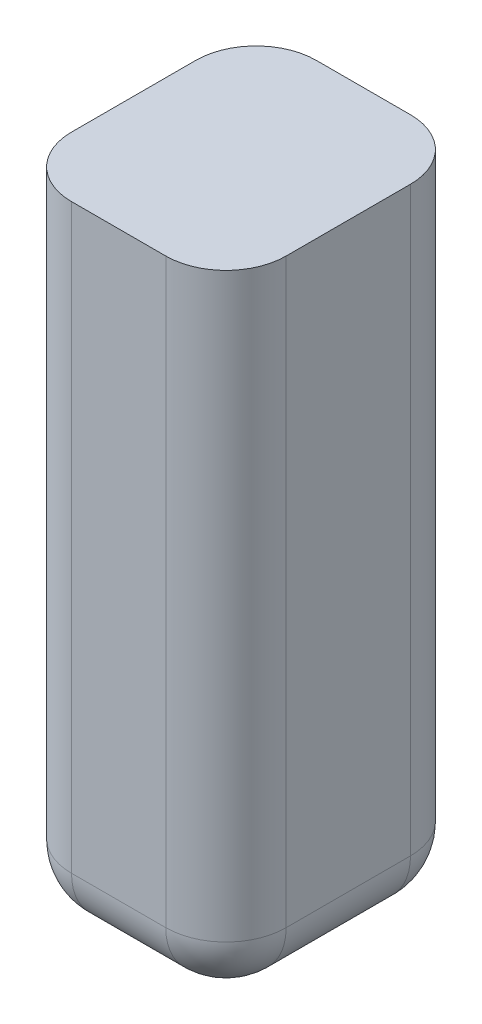
ISO-10303-21;
HEADER;
FILE_DESCRIPTION(('STEP AP214'),'2;1');
FILE_NAME('part.step','',(''),(''),'','','');
FILE_SCHEMA(('AUTOMOTIVE_DESIGN { 1 0 10303 214 1 1 1 1 }'));
ENDSEC;
DATA;
#1=APPLICATION_CONTEXT('core data for automotive mechanical design processes');
#2=APPLICATION_PROTOCOL_DEFINITION('international standard','automotive_design',2000,#1);
#3=PRODUCT_CONTEXT('',#1,'mechanical');
#4=PRODUCT('Part','Part','',(#3));
#5=PRODUCT_RELATED_PRODUCT_CATEGORY('part','',(#4));
#6=PRODUCT_DEFINITION_FORMATION('','',#4);
#7=PRODUCT_DEFINITION_CONTEXT('part definition',#1,'design');
#8=PRODUCT_DEFINITION('design','',#6,#7);
#9=PRODUCT_DEFINITION_SHAPE('','',#8);
#10=(LENGTH_UNIT() NAMED_UNIT(*) SI_UNIT(.MILLI.,.METRE.));
#11=(NAMED_UNIT(*) PLANE_ANGLE_UNIT() SI_UNIT($,.RADIAN.));
#12=(NAMED_UNIT(*) SI_UNIT($,.STERADIAN.) SOLID_ANGLE_UNIT());
#13=UNCERTAINTY_MEASURE_WITH_UNIT(LENGTH_MEASURE(1.E-05),#10,'distance_accuracy_value','');
#14=(GEOMETRIC_REPRESENTATION_CONTEXT(3) GLOBAL_UNCERTAINTY_ASSIGNED_CONTEXT((#13)) GLOBAL_UNIT_ASSIGNED_CONTEXT((#10,
#11,#12)) REPRESENTATION_CONTEXT('',''));
#15=CARTESIAN_POINT('',(0.,0.,0.));
#16=DIRECTION('',(0.,0.,1.));
#17=DIRECTION('',(1.,0.,0.));
#18=AXIS2_PLACEMENT_3D('',#15,#16,#17);
#19=CARTESIAN_POINT('',(0.,0.,0.));
#20=DIRECTION('',(0.,-1.,0.));
#21=DIRECTION('',(0.,0.,-1.));
#22=AXIS2_PLACEMENT_3D('',#19,#20,#21);
#23=PLANE('',#22);
#24=DIRECTION('',(1.,0.,0.));
#25=VECTOR('',#24,1.);
#26=CARTESIAN_POINT('',(-2.675,0.,1.55));
#27=LINE('',#26,#25);
#28=CARTESIAN_POINT('',(1.175,0.,1.55));
#29=VERTEX_POINT('',#28);
#30=CARTESIAN_POINT('',(-1.175,0.,1.55));
#31=VERTEX_POINT('',#30);
#32=EDGE_CURVE('E178',#29,#31,#27,.F.);
#33=ORIENTED_EDGE('',*,*,#32,.T.);
#34=DIRECTION('',(0.,0.,1.));
#35=VECTOR('',#34,1.);
#36=CARTESIAN_POINT('',(-1.175,0.,-3.05));
#37=LINE('',#36,#35);
#38=CARTESIAN_POINT('',(-1.175,0.,-1.55));
#39=VERTEX_POINT('',#38);
#40=EDGE_CURVE('E195',#31,#39,#37,.F.);
#41=ORIENTED_EDGE('',*,*,#40,.T.);
#42=DIRECTION('',(-1.,0.,0.));
#43=VECTOR('',#42,1.);
#44=CARTESIAN_POINT('',(2.675,0.,-1.55));
#45=LINE('',#44,#43);
#46=CARTESIAN_POINT('',(1.175,0.,-1.55));
#47=VERTEX_POINT('',#46);
#48=EDGE_CURVE('E191',#39,#47,#45,.F.);
#49=ORIENTED_EDGE('',*,*,#48,.T.);
#50=DIRECTION('',(0.,0.,-1.));
#51=VECTOR('',#50,1.);
#52=CARTESIAN_POINT('',(1.175,0.,3.05));
#53=LINE('',#52,#51);
#54=EDGE_CURVE('E187',#47,#29,#53,.F.);
#55=ORIENTED_EDGE('',*,*,#54,.T.);
#56=EDGE_LOOP('',(#33,#41,#49,#55));
#57=FACE_BOUND('',#56,.T.);
#58=DIRECTION('',(1.,0.,0.));
#59=VECTOR('',#58,1.);
#60=CARTESIAN_POINT('',(-0.675,0.,1.05));
#61=LINE('',#60,#59);
#62=CARTESIAN_POINT('',(-0.675,0.,1.05));
#63=VERTEX_POINT('',#62);
#64=CARTESIAN_POINT('',(0.675,0.,1.05));
#65=VERTEX_POINT('',#64);
#66=EDGE_CURVE('E166',#63,#65,#61,.T.);
#67=ORIENTED_EDGE('',*,*,#66,.T.);
#68=DIRECTION('',(0.,0.,-1.));
#69=VECTOR('',#68,1.);
#70=CARTESIAN_POINT('',(0.675,0.,1.05));
#71=LINE('',#70,#69);
#72=CARTESIAN_POINT('',(0.675,0.,-1.05));
#73=VERTEX_POINT('',#72);
#74=EDGE_CURVE('E556',#65,#73,#71,.T.);
#75=ORIENTED_EDGE('',*,*,#74,.T.);
#76=DIRECTION('',(-1.,0.,0.));
#77=VECTOR('',#76,1.);
#78=CARTESIAN_POINT('',(-0.675,0.,-1.05));
#79=LINE('',#78,#77);
#80=CARTESIAN_POINT('',(-0.675,0.,-1.05));
#81=VERTEX_POINT('',#80);
#82=EDGE_CURVE('E170',#73,#81,#79,.T.);
#83=ORIENTED_EDGE('',*,*,#82,.T.);
#84=DIRECTION('',(0.,0.,1.));
#85=VECTOR('',#84,1.);
#86=CARTESIAN_POINT('',(-0.675,0.,1.05));
#87=LINE('',#86,#85);
#88=EDGE_CURVE('E550',#81,#63,#87,.T.);
#89=ORIENTED_EDGE('',*,*,#88,.T.);
#90=EDGE_LOOP('',(#67,#75,#83,#89));
#91=FACE_BOUND('',#90,.T.);
#92=ADVANCED_FACE('F41',(#57,#91),#23,.T.);
#93=CARTESIAN_POINT('',(-2.675,6.,3.05));
#94=DIRECTION('',(1.,0.,0.));
#95=DIRECTION('',(0.,0.,-1.));
#96=AXIS2_PLACEMENT_3D('',#93,#94,#95);
#97=PLANE('',#96);
#98=DIRECTION('',(0.,0.,1.));
#99=VECTOR('',#98,1.);
#100=CARTESIAN_POINT('',(-2.675,16.,-3.05));
#101=LINE('',#100,#99);
#102=CARTESIAN_POINT('',(-2.675,16.,-1.55));
#103=VERTEX_POINT('',#102);
#104=CARTESIAN_POINT('',(-2.675,16.,1.55));
#105=VERTEX_POINT('',#104);
#106=EDGE_CURVE('E314',#103,#105,#101,.T.);
#107=ORIENTED_EDGE('',*,*,#106,.F.);
#108=DIRECTION('',(0.,-1.,0.));
#109=VECTOR('',#108,1.);
#110=CARTESIAN_POINT('',(-2.675,6.,-1.55));
#111=LINE('',#110,#109);
#112=CARTESIAN_POINT('',(-2.675,1.5,-1.55));
#113=VERTEX_POINT('',#112);
#114=EDGE_CURVE('E241',#103,#113,#111,.T.);
#115=ORIENTED_EDGE('',*,*,#114,.T.);
#116=DIRECTION('',(0.,0.,1.));
#117=VECTOR('',#116,1.);
#118=CARTESIAN_POINT('',(-2.675,1.5,3.05));
#119=LINE('',#118,#117);
#120=CARTESIAN_POINT('',(-2.675,1.5,1.55));
#121=VERTEX_POINT('',#120);
#122=EDGE_CURVE('E172',#113,#121,#119,.T.);
#123=ORIENTED_EDGE('',*,*,#122,.T.);
#124=DIRECTION('',(0.,-1.,0.));
#125=VECTOR('',#124,1.);
#126=CARTESIAN_POINT('',(-2.675,6.,1.55));
#127=LINE('',#126,#125);
#128=EDGE_CURVE('E238',#121,#105,#127,.F.);
#129=ORIENTED_EDGE('',*,*,#128,.T.);
#130=EDGE_LOOP('',(#107,#115,#123,#129));
#131=FACE_BOUND('',#130,.T.);
#132=ADVANCED_FACE('F312',(#131),#97,.F.);
#133=CARTESIAN_POINT('',(-2.675,6.,3.05));
#134=DIRECTION('',(0.,0.,-1.));
#135=DIRECTION('',(-1.,0.,0.));
#136=AXIS2_PLACEMENT_3D('',#133,#134,#135);
#137=PLANE('',#136);
#138=DIRECTION('',(1.,0.,0.));
#139=VECTOR('',#138,1.);
#140=CARTESIAN_POINT('',(-2.675,16.,3.05));
#141=LINE('',#140,#139);
#142=CARTESIAN_POINT('',(-1.175,16.,3.05));
#143=VERTEX_POINT('',#142);
#144=CARTESIAN_POINT('',(1.175,16.,3.05));
#145=VERTEX_POINT('',#144);
#146=EDGE_CURVE('E300',#143,#145,#141,.T.);
#147=ORIENTED_EDGE('',*,*,#146,.F.);
#148=DIRECTION('',(0.,-1.,0.));
#149=VECTOR('',#148,1.);
#150=CARTESIAN_POINT('',(-1.175,6.,3.05));
#151=LINE('',#150,#149);
#152=CARTESIAN_POINT('',(-1.175,1.5,3.05));
#153=VERTEX_POINT('',#152);
#154=EDGE_CURVE('E11',#143,#153,#151,.T.);
#155=ORIENTED_EDGE('',*,*,#154,.T.);
#156=DIRECTION('',(1.,0.,0.));
#157=VECTOR('',#156,1.);
#158=CARTESIAN_POINT('',(2.675,1.5,3.05));
#159=LINE('',#158,#157);
#160=CARTESIAN_POINT('',(1.175,1.5,3.05));
#161=VERTEX_POINT('',#160);
#162=EDGE_CURVE('E206',#153,#161,#159,.T.);
#163=ORIENTED_EDGE('',*,*,#162,.T.);
#164=DIRECTION('',(0.,-1.,0.));
#165=VECTOR('',#164,1.);
#166=CARTESIAN_POINT('',(1.175,6.,3.05));
#167=LINE('',#166,#165);
#168=EDGE_CURVE('E51',#161,#145,#167,.F.);
#169=ORIENTED_EDGE('',*,*,#168,.T.);
#170=EDGE_LOOP('',(#147,#155,#163,#169));
#171=FACE_BOUND('',#170,.T.);
#172=ADVANCED_FACE('F298',(#171),#137,.F.);
#173=CARTESIAN_POINT('',(2.675,6.,3.05));
#174=DIRECTION('',(-1.,0.,0.));
#175=DIRECTION('',(0.,0.,1.));
#176=AXIS2_PLACEMENT_3D('',#173,#174,#175);
#177=PLANE('',#176);
#178=DIRECTION('',(0.,0.,-1.));
#179=VECTOR('',#178,1.);
#180=CARTESIAN_POINT('',(2.675,1.5,-3.05));
#181=LINE('',#180,#179);
#182=CARTESIAN_POINT('',(2.675,1.5,1.55));
#183=VERTEX_POINT('',#182);
#184=CARTESIAN_POINT('',(2.675,1.5,-1.55));
#185=VERTEX_POINT('',#184);
#186=EDGE_CURVE('E203',#183,#185,#181,.T.);
#187=ORIENTED_EDGE('',*,*,#186,.T.);
#188=DIRECTION('',(0.,-1.,0.));
#189=VECTOR('',#188,1.);
#190=CARTESIAN_POINT('',(2.675,6.,-1.55));
#191=LINE('',#190,#189);
#192=CARTESIAN_POINT('',(2.675,16.,-1.55));
#193=VERTEX_POINT('',#192);
#194=EDGE_CURVE('E59',#185,#193,#191,.F.);
#195=ORIENTED_EDGE('',*,*,#194,.T.);
#196=DIRECTION('',(0.,0.,-1.));
#197=VECTOR('',#196,1.);
#198=CARTESIAN_POINT('',(2.675,16.,3.05));
#199=LINE('',#198,#197);
#200=CARTESIAN_POINT('',(2.675,16.,1.55));
#201=VERTEX_POINT('',#200);
#202=EDGE_CURVE('E560',#201,#193,#199,.T.);
#203=ORIENTED_EDGE('',*,*,#202,.F.);
#204=DIRECTION('',(0.,-1.,0.));
#205=VECTOR('',#204,1.);
#206=CARTESIAN_POINT('',(2.675,6.,1.55));
#207=LINE('',#206,#205);
#208=EDGE_CURVE('E261',#201,#183,#207,.T.);
#209=ORIENTED_EDGE('',*,*,#208,.T.);
#210=EDGE_LOOP('',(#187,#195,#203,#209));
#211=FACE_BOUND('',#210,.T.);
#212=ADVANCED_FACE('F333',(#211),#177,.F.);
#213=CARTESIAN_POINT('',(-2.675,6.,-3.05));
#214=DIRECTION('',(0.,0.,1.));
#215=DIRECTION('',(1.,0.,0.));
#216=AXIS2_PLACEMENT_3D('',#213,#214,#215);
#217=PLANE('',#216);
#218=DIRECTION('',(-1.,0.,0.));
#219=VECTOR('',#218,1.);
#220=CARTESIAN_POINT('',(-2.675,1.5,-3.05));
#221=LINE('',#220,#219);
#222=CARTESIAN_POINT('',(1.175,1.5,-3.05));
#223=VERTEX_POINT('',#222);
#224=CARTESIAN_POINT('',(-1.175,1.5,-3.05));
#225=VERTEX_POINT('',#224);
#226=EDGE_CURVE('E199',#223,#225,#221,.T.);
#227=ORIENTED_EDGE('',*,*,#226,.T.);
#228=DIRECTION('',(0.,-1.,0.));
#229=VECTOR('',#228,1.);
#230=CARTESIAN_POINT('',(-1.175,6.,-3.05));
#231=LINE('',#230,#229);
#232=CARTESIAN_POINT('',(-1.175,16.,-3.05));
#233=VERTEX_POINT('',#232);
#234=EDGE_CURVE('E247',#225,#233,#231,.F.);
#235=ORIENTED_EDGE('',*,*,#234,.T.);
#236=DIRECTION('',(-1.,0.,0.));
#237=VECTOR('',#236,1.);
#238=CARTESIAN_POINT('',(2.675,16.,-3.05));
#239=LINE('',#238,#237);
#240=CARTESIAN_POINT('',(1.175,16.,-3.05));
#241=VERTEX_POINT('',#240);
#242=EDGE_CURVE('E272',#241,#233,#239,.T.);
#243=ORIENTED_EDGE('',*,*,#242,.F.);
#244=DIRECTION('',(0.,-1.,0.));
#245=VECTOR('',#244,1.);
#246=CARTESIAN_POINT('',(1.175,6.,-3.05));
#247=LINE('',#246,#245);
#248=EDGE_CURVE('E244',#241,#223,#247,.T.);
#249=ORIENTED_EDGE('',*,*,#248,.T.);
#250=EDGE_LOOP('',(#227,#235,#243,#249));
#251=FACE_BOUND('',#250,.T.);
#252=ADVANCED_FACE('F360',(#251),#217,.F.);
#253=CARTESIAN_POINT('',(0.675,6.,1.05));
#254=DIRECTION('',(-1.,0.,0.));
#255=DIRECTION('',(0.,0.,1.));
#256=AXIS2_PLACEMENT_3D('',#253,#254,#255);
#257=PLANE('',#256);
#258=ORIENTED_EDGE('',*,*,#74,.F.);
#259=DIRECTION('',(0.,-1.,0.));
#260=VECTOR('',#259,1.);
#261=CARTESIAN_POINT('',(0.675,6.,1.05));
#262=LINE('',#261,#260);
#263=CARTESIAN_POINT('',(0.675,6.,1.05));
#264=VERTEX_POINT('',#263);
#265=EDGE_CURVE('E164',#264,#65,#262,.T.);
#266=ORIENTED_EDGE('',*,*,#265,.F.);
#267=DIRECTION('',(0.,0.,-1.));
#268=VECTOR('',#267,1.);
#269=CARTESIAN_POINT('',(0.675,6.,1.05));
#270=LINE('',#269,#268);
#271=CARTESIAN_POINT('',(0.675,6.,-1.05));
#272=VERTEX_POINT('',#271);
#273=EDGE_CURVE('E148',#264,#272,#270,.T.);
#274=ORIENTED_EDGE('',*,*,#273,.T.);
#275=DIRECTION('',(0.,-1.,0.));
#276=VECTOR('',#275,1.);
#277=CARTESIAN_POINT('',(0.675,6.,-1.05));
#278=LINE('',#277,#276);
#279=EDGE_CURVE('E161',#272,#73,#278,.T.);
#280=ORIENTED_EDGE('',*,*,#279,.T.);
#281=EDGE_LOOP('',(#258,#266,#274,#280));
#282=FACE_BOUND('',#281,.T.);
#283=ADVANCED_FACE('F160',(#282),#257,.T.);
#284=CARTESIAN_POINT('',(-0.675,6.,-1.05));
#285=DIRECTION('',(0.,0.,1.));
#286=DIRECTION('',(1.,0.,0.));
#287=AXIS2_PLACEMENT_3D('',#284,#285,#286);
#288=PLANE('',#287);
#289=ORIENTED_EDGE('',*,*,#82,.F.);
#290=ORIENTED_EDGE('',*,*,#279,.F.);
#291=DIRECTION('',(-1.,0.,0.));
#292=VECTOR('',#291,1.);
#293=CARTESIAN_POINT('',(-0.675,6.,-1.05));
#294=LINE('',#293,#292);
#295=CARTESIAN_POINT('',(-0.675,6.,-1.05));
#296=VERTEX_POINT('',#295);
#297=EDGE_CURVE('E145',#272,#296,#294,.T.);
#298=ORIENTED_EDGE('',*,*,#297,.T.);
#299=DIRECTION('',(0.,-1.,0.));
#300=VECTOR('',#299,1.);
#301=CARTESIAN_POINT('',(-0.675,6.,-1.05));
#302=LINE('',#301,#300);
#303=EDGE_CURVE('E173',#296,#81,#302,.T.);
#304=ORIENTED_EDGE('',*,*,#303,.T.);
#305=EDGE_LOOP('',(#289,#290,#298,#304));
#306=FACE_BOUND('',#305,.T.);
#307=ADVANCED_FACE('F168',(#306),#288,.T.);
#308=CARTESIAN_POINT('',(-0.675,6.,1.05));
#309=DIRECTION('',(1.,0.,0.));
#310=DIRECTION('',(0.,0.,-1.));
#311=AXIS2_PLACEMENT_3D('',#308,#309,#310);
#312=PLANE('',#311);
#313=ORIENTED_EDGE('',*,*,#88,.F.);
#314=ORIENTED_EDGE('',*,*,#303,.F.);
#315=DIRECTION('',(0.,0.,1.));
#316=VECTOR('',#315,1.);
#317=CARTESIAN_POINT('',(-0.675,6.,1.05));
#318=LINE('',#317,#316);
#319=CARTESIAN_POINT('',(-0.675,6.,1.05));
#320=VERTEX_POINT('',#319);
#321=EDGE_CURVE('E151',#296,#320,#318,.T.);
#322=ORIENTED_EDGE('',*,*,#321,.T.);
#323=DIRECTION('',(0.,-1.,0.));
#324=VECTOR('',#323,1.);
#325=CARTESIAN_POINT('',(-0.675,6.,1.05));
#326=LINE('',#325,#324);
#327=EDGE_CURVE('E180',#320,#63,#326,.T.);
#328=ORIENTED_EDGE('',*,*,#327,.T.);
#329=EDGE_LOOP('',(#313,#314,#322,#328));
#330=FACE_BOUND('',#329,.T.);
#331=ADVANCED_FACE('F513',(#330),#312,.T.);
#332=CARTESIAN_POINT('',(-0.675,6.,1.05));
#333=DIRECTION('',(0.,0.,-1.));
#334=DIRECTION('',(-1.,0.,0.));
#335=AXIS2_PLACEMENT_3D('',#332,#333,#334);
#336=PLANE('',#335);
#337=ORIENTED_EDGE('',*,*,#66,.F.);
#338=ORIENTED_EDGE('',*,*,#327,.F.);
#339=DIRECTION('',(1.,0.,0.));
#340=VECTOR('',#339,1.);
#341=CARTESIAN_POINT('',(-0.675,6.,1.05));
#342=LINE('',#341,#340);
#343=EDGE_CURVE('E567',#320,#264,#342,.T.);
#344=ORIENTED_EDGE('',*,*,#343,.T.);
#345=ORIENTED_EDGE('',*,*,#265,.T.);
#346=EDGE_LOOP('',(#337,#338,#344,#345));
#347=FACE_BOUND('',#346,.T.);
#348=ADVANCED_FACE('F472',(#347),#336,.T.);
#349=CARTESIAN_POINT('',(0.,6.,0.));
#350=DIRECTION('',(0.,1.,0.));
#351=DIRECTION('',(0.,0.,1.));
#352=AXIS2_PLACEMENT_3D('',#349,#350,#351);
#353=PLANE('',#352);
#354=ORIENTED_EDGE('',*,*,#273,.F.);
#355=ORIENTED_EDGE('',*,*,#343,.F.);
#356=ORIENTED_EDGE('',*,*,#321,.F.);
#357=ORIENTED_EDGE('',*,*,#297,.F.);
#358=EDGE_LOOP('',(#354,#355,#356,#357));
#359=FACE_BOUND('',#358,.T.);
#360=ADVANCED_FACE('F147',(#359),#353,.F.);
#361=CARTESIAN_POINT('',(0.,16.,0.));
#362=DIRECTION('',(0.,1.,0.));
#363=DIRECTION('',(0.,0.,1.));
#364=AXIS2_PLACEMENT_3D('',#361,#362,#363);
#365=PLANE('',#364);
#366=ORIENTED_EDGE('',*,*,#242,.T.);
#367=CARTESIAN_POINT('',(-1.175,16.,-1.55));
#368=DIRECTION('',(0.,1.,0.));
#369=DIRECTION('',(0.,0.,1.));
#370=AXIS2_PLACEMENT_3D('',#367,#368,#369);
#371=CIRCLE('',#370,1.5);
#372=EDGE_CURVE('E258',#233,#103,#371,.T.);
#373=ORIENTED_EDGE('',*,*,#372,.T.);
#374=ORIENTED_EDGE('',*,*,#106,.T.);
#375=CARTESIAN_POINT('',(-1.175,16.,1.55));
#376=DIRECTION('',(0.,1.,0.));
#377=DIRECTION('',(0.,0.,1.));
#378=AXIS2_PLACEMENT_3D('',#375,#376,#377);
#379=CIRCLE('',#378,1.5);
#380=EDGE_CURVE('E252',#105,#143,#379,.T.);
#381=ORIENTED_EDGE('',*,*,#380,.T.);
#382=ORIENTED_EDGE('',*,*,#146,.T.);
#383=CARTESIAN_POINT('',(1.175,16.,1.55));
#384=DIRECTION('',(0.,1.,0.));
#385=DIRECTION('',(0.,0.,1.));
#386=AXIS2_PLACEMENT_3D('',#383,#384,#385);
#387=CIRCLE('',#386,1.5);
#388=EDGE_CURVE('E66',#145,#201,#387,.T.);
#389=ORIENTED_EDGE('',*,*,#388,.T.);
#390=ORIENTED_EDGE('',*,*,#202,.T.);
#391=CARTESIAN_POINT('',(1.175,16.,-1.55));
#392=DIRECTION('',(0.,1.,0.));
#393=DIRECTION('',(0.,0.,1.));
#394=AXIS2_PLACEMENT_3D('',#391,#392,#393);
#395=CIRCLE('',#394,1.5);
#396=EDGE_CURVE('E255',#193,#241,#395,.T.);
#397=ORIENTED_EDGE('',*,*,#396,.T.);
#398=EDGE_LOOP('',(#366,#373,#374,#381,#382,#389,#390,#397));
#399=FACE_BOUND('',#398,.T.);
#400=ADVANCED_FACE('F376',(#399),#365,.T.);
#401=CARTESIAN_POINT('',(1.175,1.5,3.05));
#402=DIRECTION('',(0.,0.,1.));
#403=DIRECTION('',(1.,0.,0.));
#404=AXIS2_PLACEMENT_3D('',#401,#402,#403);
#405=CYLINDRICAL_SURFACE('',#404,1.5);
#406=ORIENTED_EDGE('',*,*,#54,.F.);
#407=CARTESIAN_POINT('',(1.175,1.5,-1.55));
#408=DIRECTION('',(0.,0.,1.));
#409=DIRECTION('',(1.,0.,0.));
#410=AXIS2_PLACEMENT_3D('',#407,#408,#409);
#411=CIRCLE('',#410,1.5);
#412=EDGE_CURVE('E228',#47,#185,#411,.T.);
#413=ORIENTED_EDGE('',*,*,#412,.T.);
#414=ORIENTED_EDGE('',*,*,#186,.F.);
#415=CARTESIAN_POINT('',(1.175,1.5,1.55));
#416=DIRECTION('',(0.,0.,1.));
#417=DIRECTION('',(1.,0.,0.));
#418=AXIS2_PLACEMENT_3D('',#415,#416,#417);
#419=CIRCLE('',#418,1.5);
#420=EDGE_CURVE('E225',#183,#29,#419,.F.);
#421=ORIENTED_EDGE('',*,*,#420,.T.);
#422=EDGE_LOOP('',(#406,#413,#414,#421));
#423=FACE_BOUND('',#422,.T.);
#424=ADVANCED_FACE('F331',(#423),#405,.T.);
#425=CARTESIAN_POINT('',(-2.675,1.5,-1.55));
#426=DIRECTION('',(1.,0.,0.));
#427=DIRECTION('',(0.,0.,-1.));
#428=AXIS2_PLACEMENT_3D('',#425,#426,#427);
#429=CYLINDRICAL_SURFACE('',#428,1.5);
#430=ORIENTED_EDGE('',*,*,#48,.F.);
#431=CARTESIAN_POINT('',(-1.175,1.5,-1.55));
#432=DIRECTION('',(1.,0.,0.));
#433=DIRECTION('',(0.,0.,-1.));
#434=AXIS2_PLACEMENT_3D('',#431,#432,#433);
#435=CIRCLE('',#434,1.5);
#436=EDGE_CURVE('E222',#39,#225,#435,.T.);
#437=ORIENTED_EDGE('',*,*,#436,.T.);
#438=ORIENTED_EDGE('',*,*,#226,.F.);
#439=CARTESIAN_POINT('',(1.175,1.5,-1.55));
#440=DIRECTION('',(1.,0.,0.));
#441=DIRECTION('',(0.,0.,-1.));
#442=AXIS2_PLACEMENT_3D('',#439,#440,#441);
#443=CIRCLE('',#442,1.5);
#444=EDGE_CURVE('E218',#223,#47,#443,.F.);
#445=ORIENTED_EDGE('',*,*,#444,.T.);
#446=EDGE_LOOP('',(#430,#437,#438,#445));
#447=FACE_BOUND('',#446,.T.);
#448=ADVANCED_FACE('F324',(#447),#429,.T.);
#449=CARTESIAN_POINT('',(-2.675,1.5,1.55));
#450=DIRECTION('',(-1.,0.,0.));
#451=DIRECTION('',(0.,0.,1.));
#452=AXIS2_PLACEMENT_3D('',#449,#450,#451);
#453=CYLINDRICAL_SURFACE('',#452,1.5);
#454=ORIENTED_EDGE('',*,*,#162,.F.);
#455=CARTESIAN_POINT('',(-1.175,1.5,1.55));
#456=DIRECTION('',(-1.,0.,0.));
#457=DIRECTION('',(0.,0.,1.));
#458=AXIS2_PLACEMENT_3D('',#455,#456,#457);
#459=CIRCLE('',#458,1.5);
#460=EDGE_CURVE('E235',#153,#31,#459,.F.);
#461=ORIENTED_EDGE('',*,*,#460,.T.);
#462=ORIENTED_EDGE('',*,*,#32,.F.);
#463=CARTESIAN_POINT('',(1.175,1.5,1.55));
#464=DIRECTION('',(-1.,0.,0.));
#465=DIRECTION('',(0.,0.,1.));
#466=AXIS2_PLACEMENT_3D('',#463,#464,#465);
#467=CIRCLE('',#466,1.5);
#468=EDGE_CURVE('E231',#29,#161,#467,.T.);
#469=ORIENTED_EDGE('',*,*,#468,.T.);
#470=EDGE_LOOP('',(#454,#461,#462,#469));
#471=FACE_BOUND('',#470,.T.);
#472=ADVANCED_FACE('F297',(#471),#453,.T.);
#473=CARTESIAN_POINT('',(-1.175,1.5,3.05));
#474=DIRECTION('',(0.,0.,-1.));
#475=DIRECTION('',(-1.,0.,0.));
#476=AXIS2_PLACEMENT_3D('',#473,#474,#475);
#477=CYLINDRICAL_SURFACE('',#476,1.5);
#478=ORIENTED_EDGE('',*,*,#122,.F.);
#479=CARTESIAN_POINT('',(-1.175,1.5,-1.55));
#480=DIRECTION('',(0.,0.,-1.));
#481=DIRECTION('',(-1.,0.,0.));
#482=AXIS2_PLACEMENT_3D('',#479,#480,#481);
#483=CIRCLE('',#482,1.5);
#484=EDGE_CURVE('E214',#113,#39,#483,.F.);
#485=ORIENTED_EDGE('',*,*,#484,.T.);
#486=ORIENTED_EDGE('',*,*,#40,.F.);
#487=CARTESIAN_POINT('',(-1.175,1.5,1.55));
#488=DIRECTION('',(0.,0.,-1.));
#489=DIRECTION('',(-1.,0.,0.));
#490=AXIS2_PLACEMENT_3D('',#487,#488,#489);
#491=CIRCLE('',#490,1.5);
#492=EDGE_CURVE('E210',#31,#121,#491,.T.);
#493=ORIENTED_EDGE('',*,*,#492,.T.);
#494=EDGE_LOOP('',(#478,#485,#486,#493));
#495=FACE_BOUND('',#494,.T.);
#496=ADVANCED_FACE('F310',(#495),#477,.T.);
#497=CARTESIAN_POINT('',(-1.175,6.,-1.55));
#498=DIRECTION('',(0.,-1.,0.));
#499=DIRECTION('',(0.,0.,-1.));
#500=AXIS2_PLACEMENT_3D('',#497,#498,#499);
#501=CYLINDRICAL_SURFACE('',#500,1.5);
#502=ORIENTED_EDGE('',*,*,#372,.F.);
#503=ORIENTED_EDGE('',*,*,#234,.F.);
#504=CARTESIAN_POINT('',(-1.175,1.5,-1.55));
#505=DIRECTION('',(0.,-1.,0.));
#506=DIRECTION('',(0.,0.,-1.));
#507=AXIS2_PLACEMENT_3D('',#504,#505,#506);
#508=CIRCLE('',#507,1.5);
#509=EDGE_CURVE('E268',#113,#225,#508,.T.);
#510=ORIENTED_EDGE('',*,*,#509,.F.);
#511=ORIENTED_EDGE('',*,*,#114,.F.);
#512=EDGE_LOOP('',(#502,#503,#510,#511));
#513=FACE_BOUND('',#512,.T.);
#514=ADVANCED_FACE('F317',(#513),#501,.T.);
#515=CARTESIAN_POINT('',(-1.175,1.5,-1.55));
#516=DIRECTION('',(0.,0.,1.));
#517=DIRECTION('',(1.,0.,0.));
#518=AXIS2_PLACEMENT_3D('',#515,#516,#517);
#519=SPHERICAL_SURFACE('',#518,1.5);
#520=ORIENTED_EDGE('',*,*,#509,.T.);
#521=ORIENTED_EDGE('',*,*,#436,.F.);
#522=ORIENTED_EDGE('',*,*,#484,.F.);
#523=EDGE_LOOP('',(#520,#521,#522));
#524=FACE_BOUND('',#523,.T.);
#525=ADVANCED_FACE('F321',(#524),#519,.T.);
#526=CARTESIAN_POINT('',(1.175,6.,-1.55));
#527=DIRECTION('',(0.,-1.,0.));
#528=DIRECTION('',(0.,0.,-1.));
#529=AXIS2_PLACEMENT_3D('',#526,#527,#528);
#530=CYLINDRICAL_SURFACE('',#529,1.5);
#531=ORIENTED_EDGE('',*,*,#396,.F.);
#532=ORIENTED_EDGE('',*,*,#194,.F.);
#533=CARTESIAN_POINT('',(1.175,1.5,-1.55));
#534=DIRECTION('',(0.,-1.,0.));
#535=DIRECTION('',(0.,0.,-1.));
#536=AXIS2_PLACEMENT_3D('',#533,#534,#535);
#537=CIRCLE('',#536,1.5);
#538=EDGE_CURVE('E273',#223,#185,#537,.T.);
#539=ORIENTED_EDGE('',*,*,#538,.F.);
#540=ORIENTED_EDGE('',*,*,#248,.F.);
#541=EDGE_LOOP('',(#531,#532,#539,#540));
#542=FACE_BOUND('',#541,.T.);
#543=ADVANCED_FACE('F337',(#542),#530,.T.);
#544=CARTESIAN_POINT('',(1.175,1.5,-1.55));
#545=DIRECTION('',(0.,0.,1.));
#546=DIRECTION('',(1.,0.,0.));
#547=AXIS2_PLACEMENT_3D('',#544,#545,#546);
#548=SPHERICAL_SURFACE('',#547,1.5);
#549=ORIENTED_EDGE('',*,*,#538,.T.);
#550=ORIENTED_EDGE('',*,*,#412,.F.);
#551=ORIENTED_EDGE('',*,*,#444,.F.);
#552=EDGE_LOOP('',(#549,#550,#551));
#553=FACE_BOUND('',#552,.T.);
#554=ADVANCED_FACE('F340',(#553),#548,.T.);
#555=CARTESIAN_POINT('',(-1.175,6.,1.55));
#556=DIRECTION('',(0.,-1.,0.));
#557=DIRECTION('',(0.,0.,-1.));
#558=AXIS2_PLACEMENT_3D('',#555,#556,#557);
#559=CYLINDRICAL_SURFACE('',#558,1.5);
#560=ORIENTED_EDGE('',*,*,#380,.F.);
#561=ORIENTED_EDGE('',*,*,#128,.F.);
#562=CARTESIAN_POINT('',(-1.175,1.5,1.55));
#563=DIRECTION('',(0.,-1.,0.));
#564=DIRECTION('',(0.,0.,-1.));
#565=AXIS2_PLACEMENT_3D('',#562,#563,#564);
#566=CIRCLE('',#565,1.5);
#567=EDGE_CURVE('E276',#153,#121,#566,.T.);
#568=ORIENTED_EDGE('',*,*,#567,.F.);
#569=ORIENTED_EDGE('',*,*,#154,.F.);
#570=EDGE_LOOP('',(#560,#561,#568,#569));
#571=FACE_BOUND('',#570,.T.);
#572=ADVANCED_FACE('F303',(#571),#559,.T.);
#573=CARTESIAN_POINT('',(-1.175,1.5,1.55));
#574=DIRECTION('',(0.,0.,1.));
#575=DIRECTION('',(1.,0.,0.));
#576=AXIS2_PLACEMENT_3D('',#573,#574,#575);
#577=SPHERICAL_SURFACE('',#576,1.5);
#578=ORIENTED_EDGE('',*,*,#492,.F.);
#579=ORIENTED_EDGE('',*,*,#460,.F.);
#580=ORIENTED_EDGE('',*,*,#567,.T.);
#581=EDGE_LOOP('',(#578,#579,#580));
#582=FACE_BOUND('',#581,.T.);
#583=ADVANCED_FACE('F347',(#582),#577,.T.);
#584=CARTESIAN_POINT('',(1.175,6.,1.55));
#585=DIRECTION('',(0.,-1.,0.));
#586=DIRECTION('',(0.,0.,-1.));
#587=AXIS2_PLACEMENT_3D('',#584,#585,#586);
#588=CYLINDRICAL_SURFACE('',#587,1.5);
#589=ORIENTED_EDGE('',*,*,#388,.F.);
#590=ORIENTED_EDGE('',*,*,#168,.F.);
#591=CARTESIAN_POINT('',(1.175,1.5,1.55));
#592=DIRECTION('',(0.,-1.,0.));
#593=DIRECTION('',(0.,0.,-1.));
#594=AXIS2_PLACEMENT_3D('',#591,#592,#593);
#595=CIRCLE('',#594,1.5);
#596=EDGE_CURVE('E45',#183,#161,#595,.T.);
#597=ORIENTED_EDGE('',*,*,#596,.F.);
#598=ORIENTED_EDGE('',*,*,#208,.F.);
#599=EDGE_LOOP('',(#589,#590,#597,#598));
#600=FACE_BOUND('',#599,.T.);
#601=ADVANCED_FACE('F43',(#600),#588,.T.);
#602=CARTESIAN_POINT('',(1.175,1.5,1.55));
#603=DIRECTION('',(0.,0.,1.));
#604=DIRECTION('',(1.,0.,0.));
#605=AXIS2_PLACEMENT_3D('',#602,#603,#604);
#606=SPHERICAL_SURFACE('',#605,1.5);
#607=ORIENTED_EDGE('',*,*,#468,.F.);
#608=ORIENTED_EDGE('',*,*,#420,.F.);
#609=ORIENTED_EDGE('',*,*,#596,.T.);
#610=EDGE_LOOP('',(#607,#608,#609));
#611=FACE_BOUND('',#610,.T.);
#612=ADVANCED_FACE('F289',(#611),#606,.T.);
#613=CLOSED_SHELL('',(#92,#132,#172,#212,#252,#283,#307,#331,#348,#360,#400,#424,#448,#472,#496,
#514,#525,#543,#554,#572,#583,#601,#612));
#614=MANIFOLD_SOLID_BREP('B2',#613);
#615=ADVANCED_BREP_SHAPE_REPRESENTATION('',(#18,#614),#14);
#616=SHAPE_DEFINITION_REPRESENTATION(#9,#615);
ENDSEC;
END-ISO-10303-21;
